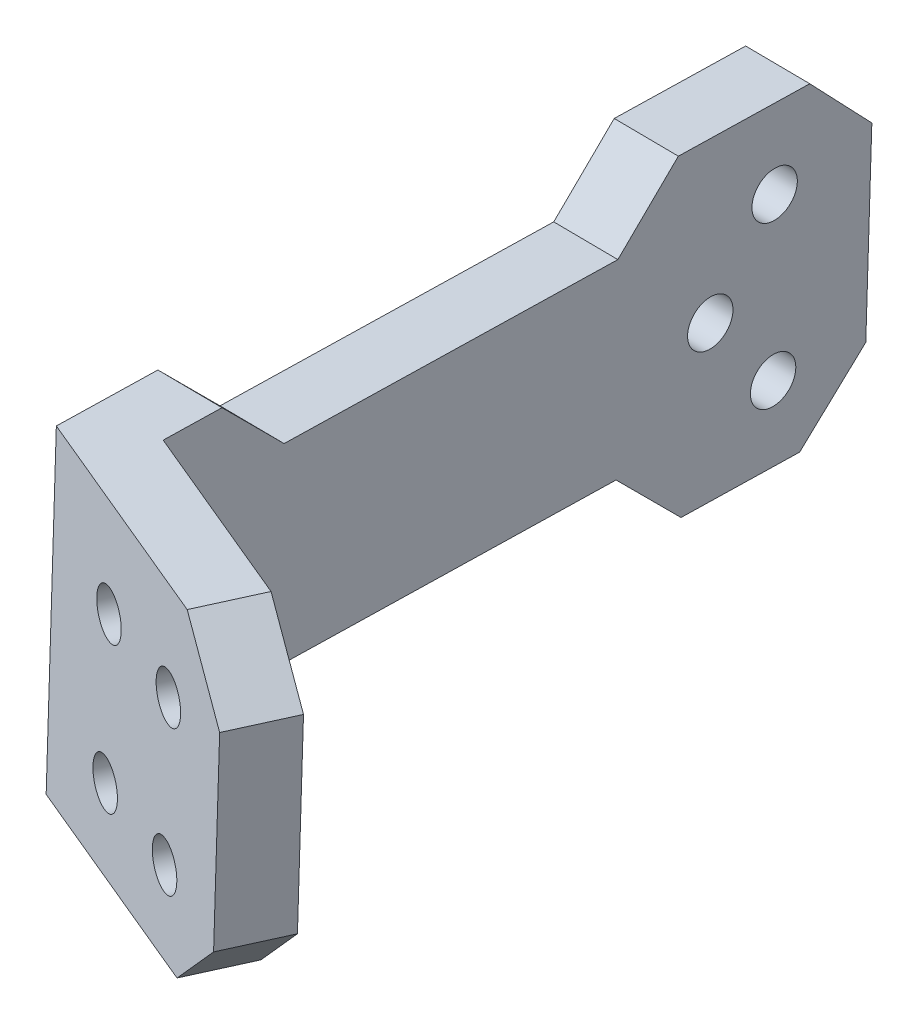
ISO-10303-21;
HEADER;
FILE_DESCRIPTION(('STEP AP214'),'2;1');
FILE_NAME('part.step','',(''),(''),'','','');
FILE_SCHEMA(('AUTOMOTIVE_DESIGN { 1 0 10303 214 1 1 1 1 }'));
ENDSEC;
DATA;
#1=APPLICATION_CONTEXT('core data for automotive mechanical design processes');
#2=APPLICATION_PROTOCOL_DEFINITION('international standard','automotive_design',2000,#1);
#3=PRODUCT_CONTEXT('',#1,'mechanical');
#4=PRODUCT('Part','Part','',(#3));
#5=PRODUCT_RELATED_PRODUCT_CATEGORY('part','',(#4));
#6=PRODUCT_DEFINITION_FORMATION('','',#4);
#7=PRODUCT_DEFINITION_CONTEXT('part definition',#1,'design');
#8=PRODUCT_DEFINITION('design','',#6,#7);
#9=PRODUCT_DEFINITION_SHAPE('','',#8);
#10=(LENGTH_UNIT() NAMED_UNIT(*) SI_UNIT(.MILLI.,.METRE.));
#11=(NAMED_UNIT(*) PLANE_ANGLE_UNIT() SI_UNIT($,.RADIAN.));
#12=(NAMED_UNIT(*) SI_UNIT($,.STERADIAN.) SOLID_ANGLE_UNIT());
#13=UNCERTAINTY_MEASURE_WITH_UNIT(LENGTH_MEASURE(1.E-05),#10,'distance_accuracy_value','');
#14=(GEOMETRIC_REPRESENTATION_CONTEXT(3) GLOBAL_UNCERTAINTY_ASSIGNED_CONTEXT((#13)) GLOBAL_UNIT_ASSIGNED_CONTEXT((#10,
#11,#12)) REPRESENTATION_CONTEXT('',''));
#15=CARTESIAN_POINT('',(0.,0.,0.));
#16=DIRECTION('',(0.,0.,1.));
#17=DIRECTION('',(1.,0.,0.));
#18=AXIS2_PLACEMENT_3D('',#15,#16,#17);
#19=CARTESIAN_POINT('',(0.677625199987656,71.7125158688856,-1.62510661202803));
#20=DIRECTION('',(-0.00944634334495136,-0.999698722892989,0.0226545810717298));
#21=DIRECTION('',(0.,-0.0226555919120575,-0.999743329137591));
#22=AXIS2_PLACEMENT_3D('',#19,#20,#21);
#23=PLANE('',#22);
#24=DIRECTION('',(0.,0.0226555919120575,0.999743329137591));
#25=VECTOR('',#24,1.);
#26=CARTESIAN_POINT('',(-79.7096790930301,74.4273959437813,84.6574894141304));
#27=LINE('',#26,#25);
#28=CARTESIAN_POINT('',(-79.7096790930301,72.8806724105701,16.403852945465));
#29=VERTEX_POINT('',#28);
#30=CARTESIAN_POINT('',(-79.7096790930301,73.1756143071616,29.4190147097265));
#31=VERTEX_POINT('',#30);
#32=EDGE_CURVE('E290',#29,#31,#27,.T.);
#33=ORIENTED_EDGE('',*,*,#32,.T.);
#34=DIRECTION('',(0.999955382303335,-0.00944391874385843,0.000214012499883211));
#35=VECTOR('',#34,1.);
#36=CARTESIAN_POINT('',(0.677625199987693,72.4164092634002,29.4362193653092));
#37=LINE('',#36,#35);
#38=CARTESIAN_POINT('',(-73.359962415404,73.1156454231381,29.4203736891007));
#39=VERTEX_POINT('',#38);
#40=EDGE_CURVE('E11',#31,#39,#37,.T.);
#41=ORIENTED_EDGE('',*,*,#40,.T.);
#42=DIRECTION('',(0.,-0.0226555919120574,-0.999743329137591));
#43=VECTOR('',#42,1.);
#44=CARTESIAN_POINT('',(-73.359962415404,72.676840517905,10.0568417848155));
#45=LINE('',#44,#43);
#46=CARTESIAN_POINT('',(-73.359962415404,72.8207035265466,16.4052119248392));
#47=VERTEX_POINT('',#46);
#48=EDGE_CURVE('E190',#39,#47,#45,.T.);
#49=ORIENTED_EDGE('',*,*,#48,.T.);
#50=DIRECTION('',(-0.999955382303335,0.0094439187438584,-0.000214012499884351));
#51=VECTOR('',#50,1.);
#52=CARTESIAN_POINT('',(-79.7096790930301,72.8806724105701,16.403852945465));
#53=LINE('',#52,#51);
#54=EDGE_CURVE('E251',#47,#29,#53,.T.);
#55=ORIENTED_EDGE('',*,*,#54,.T.);
#56=EDGE_LOOP('',(#33,#41,#49,#55));
#57=FACE_BOUND('',#56,.T.);
#58=ADVANCED_FACE('F39',(#57),#23,.F.);
#59=CARTESIAN_POINT('',(-14.6991602759016,44.2871439133381,167.493261540189));
#60=DIRECTION('',(0.00944634334495239,0.999698722892989,-0.0226545810717298));
#61=DIRECTION('',(-0.999955376576697,0.00944634334495237,-0.000107017596546688));
#62=AXIS2_PLACEMENT_3D('',#59,#60,#61);
#63=PLANE('',#62);
#64=DIRECTION('',(0.,-0.0226555919120575,-0.999743329137591));
#65=VECTOR('',#64,1.);
#66=CARTESIAN_POINT('',(-80.0062344739473,43.0431846417096,85.3686998448665));
#67=LINE('',#66,#65);
#68=CARTESIAN_POINT('',(-80.0062344739473,43.0431846417095,85.3686998448665));
#69=VERTEX_POINT('',#68);
#70=CARTESIAN_POINT('',(-80.0062344739473,42.7991965757842,74.6020228035035));
#71=VERTEX_POINT('',#70);
#72=EDGE_CURVE('E215',#69,#71,#67,.T.);
#73=ORIENTED_EDGE('',*,*,#72,.T.);
#74=DIRECTION('',(0.999955382303335,-0.00944391874385943,0.000214012499884219));
#75=VECTOR('',#74,1.);
#76=CARTESIAN_POINT('',(-14.6991602759016,42.1824143542566,74.6159999573412));
#77=LINE('',#76,#75);
#78=CARTESIAN_POINT('',(-73.6565177963211,42.7392276917607,74.6033817828778));
#79=VERTEX_POINT('',#78);
#80=EDGE_CURVE('E172',#71,#79,#77,.T.);
#81=ORIENTED_EDGE('',*,*,#80,.T.);
#82=DIRECTION('',(0.,0.0226555919120575,0.999743329137591));
#83=VECTOR('',#82,1.);
#84=CARTESIAN_POINT('',(-73.6565177963211,41.2926292158333,10.7680522155516));
#85=LINE('',#84,#83);
#86=CARTESIAN_POINT('',(-73.6565177963211,42.8873230611118,81.1385170448318));
#87=VERTEX_POINT('',#86);
#88=EDGE_CURVE('E274',#79,#87,#85,.T.);
#89=ORIENTED_EDGE('',*,*,#88,.T.);
#90=DIRECTION('',(0.922976587647695,0.,0.38485610123034));
#91=VECTOR('',#90,1.);
#92=CARTESIAN_POINT('',(-49.4786824739531,42.8873230611118,91.2200159288615));
#93=LINE('',#92,#91);
#94=CARTESIAN_POINT('',(-55.339583805516,42.8873230611118,88.7761796860488));
#95=VERTEX_POINT('',#94);
#96=EDGE_CURVE('E201',#87,#95,#93,.T.);
#97=ORIENTED_EDGE('',*,*,#96,.T.);
#98=DIRECTION('',(-0.384740152897546,0.0245451308027948,0.922698515931529));
#99=VECTOR('',#98,1.);
#100=CARTESIAN_POINT('',(-57.7826837764154,43.0431846417096,94.635315262214));
#101=LINE('',#100,#99);
#102=CARTESIAN_POINT('',(-57.7826837764154,43.0431846417096,94.635315262214));
#103=VERTEX_POINT('',#102);
#104=EDGE_CURVE('E214',#95,#103,#101,.T.);
#105=ORIENTED_EDGE('',*,*,#104,.T.);
#106=DIRECTION('',(-0.922976587647694,0.,-0.384856101230341));
#107=VECTOR('',#106,1.);
#108=CARTESIAN_POINT('',(-80.0062344739473,43.0431846417096,85.3686998448665));
#109=LINE('',#108,#107);
#110=EDGE_CURVE('E212',#103,#69,#109,.T.);
#111=ORIENTED_EDGE('',*,*,#110,.T.);
#112=EDGE_LOOP('',(#73,#81,#89,#97,#105,#111));
#113=FACE_BOUND('',#112,.T.);
#114=ADVANCED_FACE('F272',(#113),#63,.F.);
#115=CARTESIAN_POINT('',(-80.8710501892957,-48.4795490342398,87.4427338938127));
#116=DIRECTION('',(-0.999955382303335,0.00944391874385943,-0.000214012499884421));
#117=DIRECTION('',(-0.00944391896013155,-0.999955405202989,0.));
#118=AXIS2_PLACEMENT_3D('',#115,#116,#117);
#119=PLANE('',#118);
#120=DIRECTION('',(-0.00682918207909545,-0.707073818757855,0.707106764993317));
#121=VECTOR('',#120,1.);
#122=CARTESIAN_POINT('',(-80.5773681736715,-16.662410896713,119.261225933014));
#123=LINE('',#122,#121);
#124=CARTESIAN_POINT('',(-79.766958551444,67.2450643631087,35.3498409888518));
#125=VERTEX_POINT('',#124);
#126=EDGE_CURVE('E323',#31,#125,#123,.T.);
#127=ORIENTED_EDGE('',*,*,#126,.F.);
#128=ORIENTED_EDGE('',*,*,#32,.F.);
#129=DIRECTION('',(-0.00667957343663226,-0.722913668773976,-0.690906079578444));
#130=VECTOR('',#129,1.);
#131=CARTESIAN_POINT('',(-79.9679082336864,44.9331728842632,-10.3062483650945));
#132=LINE('',#131,#130);
#133=CARTESIAN_POINT('',(-79.7696633732706,66.388722511558,10.1993393952467));
#134=VERTEX_POINT('',#133);
#135=EDGE_CURVE('E244',#29,#134,#132,.T.);
#136=ORIENTED_EDGE('',*,*,#135,.T.);
#137=DIRECTION('',(0.00944634334495239,0.999698722892989,-0.0226545810717298));
#138=VECTOR('',#137,1.);
#139=CARTESIAN_POINT('',(-80.8710501892957,-50.1701355760925,12.8407272851236));
#140=LINE('',#139,#138);
#141=CARTESIAN_POINT('',(-79.9462501937068,47.7006849902273,10.6228366463719));
#142=VERTEX_POINT('',#141);
#143=EDGE_CURVE('E198',#142,#134,#140,.T.);
#144=ORIENTED_EDGE('',*,*,#143,.F.);
#145=DIRECTION('',(-0.00667957343663225,-0.690873823428353,0.722944495379966));
#146=VECTOR('',#145,1.);
#147=CARTESIAN_POINT('',(-80.761098739098,-36.5797762413307,98.815634591854));
#148=LINE('',#147,#146);
#149=CARTESIAN_POINT('',(-80.0062344739473,41.4964611084984,17.115063376201));
#150=VERTEX_POINT('',#149);
#151=EDGE_CURVE('E246',#142,#150,#148,.T.);
#152=ORIENTED_EDGE('',*,*,#151,.T.);
#153=CARTESIAN_POINT('',(-80.0062344739472,41.7625322039023,28.8562177781239));
#154=VERTEX_POINT('',#153);
#155=EDGE_CURVE('E285',#154,#150,#67,.T.);
#156=ORIENTED_EDGE('',*,*,#155,.F.);
#157=DIRECTION('',(-0.00652653619627508,-0.707076677048504,-0.707106764993325));
#158=VECTOR('',#157,1.);
#159=CARTESIAN_POINT('',(-80.1523426907388,25.9333527875086,13.0263647891287));
#160=LINE('',#159,#158);
#161=CARTESIAN_POINT('',(-79.9462988757775,48.2558791058935,35.3498409888517));
#162=VERTEX_POINT('',#161);
#163=EDGE_CURVE('E63',#162,#154,#160,.T.);
#164=ORIENTED_EDGE('',*,*,#163,.F.);
#165=DIRECTION('',(0.,-0.0226555919120575,-0.999743329137591));
#166=VECTOR('',#165,1.);
#167=CARTESIAN_POINT('',(-79.9462988757775,49.3861195487064,85.2249600062605));
#168=LINE('',#167,#166);
#169=CARTESIAN_POINT('',(-79.9462988757775,49.0047555704962,68.3961746596215));
#170=VERTEX_POINT('',#169);
#171=EDGE_CURVE('E320',#170,#162,#168,.T.);
#172=ORIENTED_EDGE('',*,*,#171,.F.);
#173=DIRECTION('',(0.00682918207909539,0.707073818757849,-0.707106764993324));
#174=VECTOR('',#173,1.);
#175=CARTESIAN_POINT('',(-80.509043049518,-9.26015336031544,126.66379845465));
#176=LINE('',#175,#174);
#177=EDGE_CURVE('E319',#71,#170,#176,.T.);
#178=ORIENTED_EDGE('',*,*,#177,.F.);
#179=ORIENTED_EDGE('',*,*,#72,.F.);
#180=DIRECTION('',(0.00944634334495239,0.999698722892989,-0.0226545810717298));
#181=VECTOR('',#180,1.);
#182=CARTESIAN_POINT('',(-80.8710501892957,-48.4795490342398,87.4427338938127));
#183=LINE('',#182,#181);
#184=CARTESIAN_POINT('',(-79.7096790930301,74.4273959437813,84.6574894141304));
#185=VERTEX_POINT('',#184);
#186=EDGE_CURVE('E189',#69,#185,#183,.T.);
#187=ORIENTED_EDGE('',*,*,#186,.T.);
#188=CARTESIAN_POINT('',(-79.7096790930301,74.1995249079103,74.6020228035036));
#189=VERTEX_POINT('',#188);
#190=EDGE_CURVE('E229',#189,#185,#27,.T.);
#191=ORIENTED_EDGE('',*,*,#190,.F.);
#192=DIRECTION('',(0.00652653619627499,0.707076677048495,0.707106764993334));
#193=VECTOR('',#192,1.);
#194=CARTESIAN_POINT('',(-80.2166038918847,19.2799333346451,19.6800942593051));
#195=LINE('',#194,#193);
#196=CARTESIAN_POINT('',(-79.766958551444,67.9939408277113,68.3961746596216));
#197=VERTEX_POINT('',#196);
#198=EDGE_CURVE('E55',#197,#189,#195,.T.);
#199=ORIENTED_EDGE('',*,*,#198,.F.);
#200=DIRECTION('',(0.,0.0226555919120577,0.999743329137591));
#201=VECTOR('',#200,1.);
#202=CARTESIAN_POINT('',(-79.766958551444,68.365558115815,84.7948591970185));
#203=LINE('',#202,#201);
#204=EDGE_CURVE('E331',#125,#197,#203,.T.);
#205=ORIENTED_EDGE('',*,*,#204,.F.);
#206=EDGE_LOOP('',(#127,#128,#136,#144,#152,#156,#164,#172,#178,#179,#187,#191,#199,#205));
#207=FACE_BOUND('',#206,.T.);
#208=CARTESIAN_POINT('',(-79.9357155551836,49.0243422093975,19.810817403018));
#209=DIRECTION('',(-0.999955382303335,0.00944391874385943,-0.000214012499884421));
#210=DIRECTION('',(-0.00944391896013155,-0.999955405202989,0.));
#211=AXIS2_PLACEMENT_3D('',#208,#209,#210);
#212=CIRCLE('',#211,2.2479);
#213=CARTESIAN_POINT('',(-79.956944540614,46.7765424540417,19.810817403018));
#214=VERTEX_POINT('',#213);
#215=EDGE_CURVE('E348',#214,#214,#212,.T.);
#216=ORIENTED_EDGE('',*,*,#215,.F.);
#217=EDGE_LOOP('',(#216));
#218=FACE_BOUND('',#217,.T.);
#219=CARTESIAN_POINT('',(-79.7842211516335,65.0651032882848,19.8108174030179));
#220=DIRECTION('',(-0.999955382303335,0.00944391874385943,-0.000214012499884421));
#221=DIRECTION('',(-0.00944391896013155,-0.999955405202989,0.));
#222=AXIS2_PLACEMENT_3D('',#219,#220,#221);
#223=CIRCLE('',#222,2.2479);
#224=CARTESIAN_POINT('',(-79.805450137064,62.817303532929,19.8108174030179));
#225=VERTEX_POINT('',#224);
#226=EDGE_CURVE('E345',#225,#225,#223,.T.);
#227=ORIENTED_EDGE('',*,*,#226,.F.);
#228=EDGE_LOOP('',(#227));
#229=FACE_BOUND('',#228,.T.);
#230=CARTESIAN_POINT('',(-79.8603841444811,57.143350836971,26.105814993145));
#231=DIRECTION('',(-0.999955382303335,0.00944391874385943,-0.000214012499884421));
#232=DIRECTION('',(-0.00944391896013155,-0.999955405202989,0.));
#233=AXIS2_PLACEMENT_3D('',#230,#231,#232);
#234=CIRCLE('',#233,2.2479);
#235=CARTESIAN_POINT('',(-79.8816131299115,54.8955510816152,26.105814993145));
#236=VERTEX_POINT('',#235);
#237=EDGE_CURVE('E337',#236,#236,#234,.T.);
#238=ORIENTED_EDGE('',*,*,#237,.F.);
#239=EDGE_LOOP('',(#238));
#240=FACE_BOUND('',#239,.T.);
#241=ADVANCED_FACE('F316',(#207,#218,#229,#240),#119,.T.);
#242=CARTESIAN_POINT('',(-80.8710501892957,-50.1701355760925,12.8407272851236));
#243=DIRECTION('',(0.,-0.0226555919120575,-0.999743329137591));
#244=DIRECTION('',(0.,0.999743329137591,-0.0226555919120575));
#245=AXIS2_PLACEMENT_3D('',#242,#243,#244);
#246=PLANE('',#245);
#247=DIRECTION('',(0.00944634334495239,0.999698722892989,-0.0226545810717298));
#248=VECTOR('',#247,1.);
#249=CARTESIAN_POINT('',(-74.5213335116696,-50.230104460116,12.8420862644978));
#250=LINE('',#249,#248);
#251=CARTESIAN_POINT('',(-73.5965335160806,47.6407161062038,10.6241956257461));
#252=VERTEX_POINT('',#251);
#253=CARTESIAN_POINT('',(-73.4199466956444,66.3287536275345,10.200698374621));
#254=VERTEX_POINT('',#253);
#255=EDGE_CURVE('E202',#252,#254,#250,.T.);
#256=ORIENTED_EDGE('',*,*,#255,.F.);
#257=DIRECTION('',(-0.999955382303335,0.00944391874385943,-0.000214012499884375));
#258=VECTOR('',#257,1.);
#259=CARTESIAN_POINT('',(-79.9462501937068,47.7006849902273,10.6228366463719));
#260=LINE('',#259,#258);
#261=EDGE_CURVE('E242',#252,#142,#260,.T.);
#262=ORIENTED_EDGE('',*,*,#261,.T.);
#263=ORIENTED_EDGE('',*,*,#143,.T.);
#264=DIRECTION('',(0.999955382303335,-0.0094439187438584,0.000214012499884351));
#265=VECTOR('',#264,1.);
#266=CARTESIAN_POINT('',(-73.4199466956444,66.3287536275345,10.200698374621));
#267=LINE('',#266,#265);
#268=EDGE_CURVE('E240',#134,#254,#267,.T.);
#269=ORIENTED_EDGE('',*,*,#268,.T.);
#270=EDGE_LOOP('',(#256,#262,#263,#269));
#271=FACE_BOUND('',#270,.T.);
#272=ADVANCED_FACE('F373',(#271),#246,.T.);
#273=CARTESIAN_POINT('',(-74.5213335116696,-50.230104460116,12.8420862644978));
#274=DIRECTION('',(0.999955382303335,-0.00944391874385944,0.000214012499884224));
#275=DIRECTION('',(0.00944391896013156,0.999955405202989,0.));
#276=AXIS2_PLACEMENT_3D('',#273,#274,#275);
#277=PLANE('',#276);
#278=DIRECTION('',(0.00682918207909528,0.707073818757855,-0.707106764993317));
#279=VECTOR('',#278,1.);
#280=CARTESIAN_POINT('',(-73.4172418738179,67.1850954790851,35.3511999682261));
#281=LINE('',#280,#279);
#282=CARTESIAN_POINT('',(-73.4172418738179,67.1850954790851,35.3511999682261));
#283=VERTEX_POINT('',#282);
#284=EDGE_CURVE('E563',#283,#39,#281,.T.);
#285=ORIENTED_EDGE('',*,*,#284,.F.);
#286=DIRECTION('',(0.,-0.0226555919120577,-0.999743329137591));
#287=VECTOR('',#286,1.);
#288=CARTESIAN_POINT('',(-73.4172418738179,67.9339719436878,68.3975336389958));
#289=LINE('',#288,#287);
#290=CARTESIAN_POINT('',(-73.4172418738179,67.9339719436878,68.3975336389958));
#291=VERTEX_POINT('',#290);
#292=EDGE_CURVE('E181',#291,#283,#289,.T.);
#293=ORIENTED_EDGE('',*,*,#292,.F.);
#294=DIRECTION('',(-0.00652653619627642,-0.707076677048495,-0.707106764993333));
#295=VECTOR('',#294,1.);
#296=CARTESIAN_POINT('',(-73.3599624154039,74.1395560238868,74.6033817828779));
#297=LINE('',#296,#295);
#298=CARTESIAN_POINT('',(-73.3599624154039,74.1395560238868,74.6033817828779));
#299=VERTEX_POINT('',#298);
#300=EDGE_CURVE('E167',#299,#291,#297,.T.);
#301=ORIENTED_EDGE('',*,*,#300,.F.);
#302=CARTESIAN_POINT('',(-73.3599624154039,74.2715343631835,80.4273066140957));
#303=VERTEX_POINT('',#302);
#304=EDGE_CURVE('E179',#303,#299,#45,.T.);
#305=ORIENTED_EDGE('',*,*,#304,.F.);
#306=DIRECTION('',(0.00944634334495239,0.999698722892989,-0.0226545810717298));
#307=VECTOR('',#306,1.);
#308=CARTESIAN_POINT('',(-74.5213335116696,-48.6354106148375,83.2125510937781));
#309=LINE('',#308,#307);
#310=EDGE_CURVE('E205',#87,#303,#309,.T.);
#311=ORIENTED_EDGE('',*,*,#310,.F.);
#312=ORIENTED_EDGE('',*,*,#88,.F.);
#313=DIRECTION('',(-0.00682918207909415,-0.707073818757849,0.707106764993324));
#314=VECTOR('',#313,1.);
#315=CARTESIAN_POINT('',(-73.6565177963211,42.7392276917607,74.6033817828778));
#316=LINE('',#315,#314);
#317=CARTESIAN_POINT('',(-73.5965821981513,48.9447866864727,68.3975336389957));
#318=VERTEX_POINT('',#317);
#319=EDGE_CURVE('E281',#318,#79,#316,.T.);
#320=ORIENTED_EDGE('',*,*,#319,.F.);
#321=DIRECTION('',(0.,0.0226555919120575,0.999743329137591));
#322=VECTOR('',#321,1.);
#323=CARTESIAN_POINT('',(-73.5965821981513,48.9447866864727,68.3975336389957));
#324=LINE('',#323,#322);
#325=CARTESIAN_POINT('',(-73.5965821981513,48.19591022187,35.3511999682259));
#326=VERTEX_POINT('',#325);
#327=EDGE_CURVE('E571',#326,#318,#324,.T.);
#328=ORIENTED_EDGE('',*,*,#327,.F.);
#329=DIRECTION('',(0.00652653619627541,0.707076677048504,0.707106764993324));
#330=VECTOR('',#329,1.);
#331=CARTESIAN_POINT('',(-73.5965821981513,48.19591022187,35.3511999682259));
#332=LINE('',#331,#330);
#333=CARTESIAN_POINT('',(-73.6565177963211,41.7025633198788,28.8575767574982));
#334=VERTEX_POINT('',#333);
#335=EDGE_CURVE('E568',#334,#326,#332,.T.);
#336=ORIENTED_EDGE('',*,*,#335,.F.);
#337=CARTESIAN_POINT('',(-73.6565177963211,41.4364922244749,17.1164223555753));
#338=VERTEX_POINT('',#337);
#339=EDGE_CURVE('E282',#338,#334,#85,.T.);
#340=ORIENTED_EDGE('',*,*,#339,.F.);
#341=DIRECTION('',(0.00667957343663211,0.690873823428353,-0.722944495379966));
#342=VECTOR('',#341,1.);
#343=CARTESIAN_POINT('',(-74.0589335138751,-0.185699376786717,60.670734710996));
#344=LINE('',#343,#342);
#345=EDGE_CURVE('E238',#338,#252,#344,.T.);
#346=ORIENTED_EDGE('',*,*,#345,.T.);
#347=ORIENTED_EDGE('',*,*,#255,.T.);
#348=DIRECTION('',(0.0066795734366324,0.722913668773976,0.690906079578444));
#349=VECTOR('',#348,1.);
#350=CARTESIAN_POINT('',(-73.970640103657,6.7285717098195,-46.7606371341771));
#351=LINE('',#350,#349);
#352=EDGE_CURVE('E235',#254,#47,#351,.T.);
#353=ORIENTED_EDGE('',*,*,#352,.T.);
#354=ORIENTED_EDGE('',*,*,#48,.F.);
#355=EDGE_LOOP('',(#285,#293,#301,#305,#311,#312,#320,#328,#336,#340,#346,#347,#353,#354));
#356=FACE_BOUND('',#355,.T.);
#357=CARTESIAN_POINT('',(-73.5859988775574,48.964373325374,19.8121763823922));
#358=DIRECTION('',(0.999955382303335,-0.00944391874385944,0.000214012499884215));
#359=DIRECTION('',(0.00944391896013156,0.999955405202989,0.));
#360=AXIS2_PLACEMENT_3D('',#357,#358,#359);
#361=CIRCLE('',#360,2.2479);
#362=CARTESIAN_POINT('',(-73.5647698921269,51.2121730807298,19.8121763823922));
#363=VERTEX_POINT('',#362);
#364=EDGE_CURVE('E334',#363,#363,#361,.T.);
#365=ORIENTED_EDGE('',*,*,#364,.F.);
#366=EDGE_LOOP('',(#365));
#367=FACE_BOUND('',#366,.T.);
#368=CARTESIAN_POINT('',(-73.4345044740074,65.0051344042613,19.8121763823921));
#369=DIRECTION('',(0.999955382303335,-0.00944391874385944,0.000214012499884215));
#370=DIRECTION('',(0.00944391896013156,0.999955405202989,0.));
#371=AXIS2_PLACEMENT_3D('',#368,#369,#370);
#372=CIRCLE('',#371,2.2479);
#373=CARTESIAN_POINT('',(-73.4132754885769,67.2529341596171,19.8121763823921));
#374=VERTEX_POINT('',#373);
#375=EDGE_CURVE('E338',#374,#374,#372,.T.);
#376=ORIENTED_EDGE('',*,*,#375,.F.);
#377=EDGE_LOOP('',(#376));
#378=FACE_BOUND('',#377,.T.);
#379=CARTESIAN_POINT('',(-73.5106674668549,57.0833819529475,26.1071739725193));
#380=DIRECTION('',(0.999955382303335,-0.00944391874385944,0.000214012499884215));
#381=DIRECTION('',(0.00944391896013156,0.999955405202989,0.));
#382=AXIS2_PLACEMENT_3D('',#379,#380,#381);
#383=CIRCLE('',#382,2.2479);
#384=CARTESIAN_POINT('',(-73.4894384814244,59.3311817083033,26.1071739725193));
#385=VERTEX_POINT('',#384);
#386=EDGE_CURVE('E333',#385,#385,#383,.T.);
#387=ORIENTED_EDGE('',*,*,#386,.F.);
#388=EDGE_LOOP('',(#387));
#389=FACE_BOUND('',#388,.T.);
#390=ADVANCED_FACE('F176',(#356,#367,#378,#389),#277,.T.);
#391=CARTESIAN_POINT('',(-50.3434981893016,-48.6354106148375,93.2940499778077));
#392=DIRECTION('',(0.384740152897546,-0.0245451308027948,-0.922698515931529));
#393=DIRECTION('',(-0.922976587647695,0.,-0.38485610123034));
#394=AXIS2_PLACEMENT_3D('',#391,#392,#393);
#395=PLANE('',#394);
#396=CARTESIAN_POINT('',(-57.8117036717517,50.7250680491896,87.5368775396771));
#397=DIRECTION('',(0.384740152897547,-0.0245451308027948,-0.922698515931529));
#398=DIRECTION('',(-0.922976587647694,0.,-0.384856101230341));
#399=AXIS2_PLACEMENT_3D('',#396,#397,#398);
#400=CIRCLE('',#399,2.24789999999999);
#401=CARTESIAN_POINT('',(-59.886462743125,50.7250680491896,86.6717595097214));
#402=VERTEX_POINT('',#401);
#403=EDGE_CURVE('E355',#402,#402,#400,.T.);
#404=ORIENTED_EDGE('',*,*,#403,.F.);
#405=EDGE_LOOP('',(#404));
#406=FACE_BOUND('',#405,.T.);
#407=CARTESIAN_POINT('',(-67.8938108719946,64.9010363431659,82.9558119057789));
#408=DIRECTION('',(0.384740152897547,-0.0245451308027948,-0.922698515931529));
#409=DIRECTION('',(-0.922976587647694,0.,-0.384856101230341));
#410=AXIS2_PLACEMENT_3D('',#407,#408,#409);
#411=CIRCLE('',#410,2.2479);
#412=CARTESIAN_POINT('',(-69.9685699433679,64.9010363431659,82.0906938758232));
#413=VERTEX_POINT('',#412);
#414=EDGE_CURVE('E354',#413,#413,#411,.T.);
#415=ORIENTED_EDGE('',*,*,#414,.F.);
#416=EDGE_LOOP('',(#415));
#417=FACE_BOUND('',#416,.T.);
#418=CARTESIAN_POINT('',(-67.8938108719946,50.6133155314965,83.335886188051));
#419=DIRECTION('',(0.384740152897547,-0.0245451308027948,-0.922698515931529));
#420=DIRECTION('',(-0.922976587647694,0.,-0.384856101230341));
#421=AXIS2_PLACEMENT_3D('',#418,#419,#420);
#422=CIRCLE('',#421,2.24790000000001);
#423=CARTESIAN_POINT('',(-69.9685699433679,50.6133155314965,82.4707681580953));
#424=VERTEX_POINT('',#423);
#425=EDGE_CURVE('E351',#424,#424,#422,.T.);
#426=ORIENTED_EDGE('',*,*,#425,.F.);
#427=EDGE_LOOP('',(#426));
#428=FACE_BOUND('',#427,.T.);
#429=CARTESIAN_POINT('',(-57.8117036717517,64.9010363431659,87.1597760379145));
#430=DIRECTION('',(0.384740152897547,-0.0245451308027948,-0.922698515931529));
#431=DIRECTION('',(-0.922976587647694,0.,-0.384856101230341));
#432=AXIS2_PLACEMENT_3D('',#429,#430,#431);
#433=CIRCLE('',#432,2.24790000000001);
#434=CARTESIAN_POINT('',(-59.886462743125,64.9010363431659,86.2946580079588));
#435=VERTEX_POINT('',#434);
#436=EDGE_CURVE('E220',#435,#435,#433,.T.);
#437=ORIENTED_EDGE('',*,*,#436,.F.);
#438=EDGE_LOOP('',(#437));
#439=FACE_BOUND('',#438,.T.);
#440=DIRECTION('',(0.00944634334495239,0.999698722892989,-0.0226545810717298));
#441=VECTOR('',#440,1.);
#442=CARTESIAN_POINT('',(-50.3434981893016,-48.6354106148375,93.2940499778077));
#443=LINE('',#442,#441);
#444=CARTESIAN_POINT('',(-49.4186981937127,49.2354099514823,91.076159339056));
#445=VERTEX_POINT('',#444);
#446=CARTESIAN_POINT('',(-49.2421113732764,67.923447472813,90.6526620879308));
#447=VERTEX_POINT('',#446);
#448=EDGE_CURVE('E207',#445,#447,#443,.T.);
#449=ORIENTED_EDGE('',*,*,#448,.F.);
#450=DIRECTION('',(-0.659322577438735,-0.706893746101166,-0.256115151060229));
#451=VECTOR('',#450,1.);
#452=CARTESIAN_POINT('',(-95.0609478441965,0.299999668322178,73.3463377555557));
#453=LINE('',#452,#451);
#454=EDGE_CURVE('E264',#445,#95,#453,.T.);
#455=ORIENTED_EDGE('',*,*,#454,.T.);
#456=ORIENTED_EDGE('',*,*,#96,.F.);
#457=ORIENTED_EDGE('',*,*,#310,.T.);
#458=DIRECTION('',(-0.922976587647694,0.,-0.38485610123034));
#459=VECTOR('',#458,1.);
#460=CARTESIAN_POINT('',(-49.182127093036,74.2715343631835,90.5088054981254));
#461=LINE('',#460,#459);
#462=CARTESIAN_POINT('',(-55.0430284245989,74.2715343631835,88.0649692553127));
#463=VERTEX_POINT('',#462);
#464=EDGE_CURVE('E187',#463,#303,#461,.T.);
#465=ORIENTED_EDGE('',*,*,#464,.F.);
#466=DIRECTION('',(0.645963430565471,-0.706893746101166,0.28815356686175));
#467=VECTOR('',#466,1.);
#468=CARTESIAN_POINT('',(4.01395451241442,9.6440184289875,114.409309315704));
#469=LINE('',#468,#467);
#470=EDGE_CURVE('E262',#463,#447,#469,.T.);
#471=ORIENTED_EDGE('',*,*,#470,.T.);
#472=EDGE_LOOP('',(#449,#455,#456,#457,#465,#471));
#473=FACE_BOUND('',#472,.T.);
#474=ADVANCED_FACE('F303',(#406,#417,#428,#439,#473),#395,.T.);
#475=CARTESIAN_POINT('',(-52.786598160201,-48.4795490342398,99.1531855539729));
#476=DIRECTION('',(0.922976587647694,0.,0.38485610123034));
#477=DIRECTION('',(0.38485610123034,0.,-0.922976587647694));
#478=AXIS2_PLACEMENT_3D('',#475,#476,#477);
#479=PLANE('',#478);
#480=DIRECTION('',(0.00944634334495239,0.999698722892989,-0.0226545810717298));
#481=VECTOR('',#480,1.);
#482=CARTESIAN_POINT('',(-52.786598160201,-48.4795490342398,99.1531855539729));
#483=LINE('',#482,#481);
#484=CARTESIAN_POINT('',(-51.8617981646121,49.39127153208,96.9352949152212));
#485=VERTEX_POINT('',#484);
#486=CARTESIAN_POINT('',(-51.6852113441758,68.0793090534108,96.511797664096));
#487=VERTEX_POINT('',#486);
#488=EDGE_CURVE('E193',#485,#487,#483,.T.);
#489=ORIENTED_EDGE('',*,*,#488,.F.);
#490=DIRECTION('',(0.384740152897546,-0.0245451308027948,-0.922698515931529));
#491=VECTOR('',#490,1.);
#492=CARTESIAN_POINT('',(-49.4186981937127,49.2354099514823,91.076159339056));
#493=LINE('',#492,#491);
#494=EDGE_CURVE('E260',#485,#445,#493,.T.);
#495=ORIENTED_EDGE('',*,*,#494,.T.);
#496=ORIENTED_EDGE('',*,*,#448,.T.);
#497=DIRECTION('',(-0.384740152897546,0.0245451308027944,0.922698515931529));
#498=VECTOR('',#497,1.);
#499=CARTESIAN_POINT('',(-51.6852113441758,68.0793090534108,96.511797664096));
#500=LINE('',#499,#498);
#501=EDGE_CURVE('E258',#447,#487,#500,.T.);
#502=ORIENTED_EDGE('',*,*,#501,.T.);
#503=EDGE_LOOP('',(#489,#495,#496,#502));
#504=FACE_BOUND('',#503,.T.);
#505=ADVANCED_FACE('F307',(#504),#479,.T.);
#506=CARTESIAN_POINT('',(-80.8710501892957,-48.4795490342398,87.4427338938127));
#507=DIRECTION('',(-0.384740152897546,0.0245451308027948,0.922698515931529));
#508=DIRECTION('',(0.922976587647694,0.,0.38485610123034));
#509=AXIS2_PLACEMENT_3D('',#506,#507,#508);
#510=PLANE('',#509);
#511=CARTESIAN_POINT('',(-60.2548036426511,50.8809296297874,93.3960131158423));
#512=DIRECTION('',(-0.384740152897546,0.0245451308027948,0.922698515931529));
#513=DIRECTION('',(0.922976587647694,0.,0.38485610123034));
#514=AXIS2_PLACEMENT_3D('',#511,#512,#513);
#515=CIRCLE('',#514,2.24789999999999);
#516=CARTESIAN_POINT('',(-58.1800445712779,50.8809296297874,94.261131145798));
#517=VERTEX_POINT('',#516);
#518=EDGE_CURVE('E226',#517,#517,#515,.T.);
#519=ORIENTED_EDGE('',*,*,#518,.F.);
#520=EDGE_LOOP('',(#519));
#521=FACE_BOUND('',#520,.T.);
#522=CARTESIAN_POINT('',(-70.336910842894,65.0568979237636,88.8149474819441));
#523=DIRECTION('',(-0.384740152897546,0.0245451308027948,0.922698515931529));
#524=DIRECTION('',(0.922976587647694,0.,0.38485610123034));
#525=AXIS2_PLACEMENT_3D('',#522,#523,#524);
#526=CIRCLE('',#525,2.2479);
#527=CARTESIAN_POINT('',(-68.2621517715208,65.0568979237636,89.6800655118998));
#528=VERTEX_POINT('',#527);
#529=EDGE_CURVE('E223',#528,#528,#526,.T.);
#530=ORIENTED_EDGE('',*,*,#529,.F.);
#531=EDGE_LOOP('',(#530));
#532=FACE_BOUND('',#531,.T.);
#533=CARTESIAN_POINT('',(-70.336910842894,50.7691771120942,89.1950217642162));
#534=DIRECTION('',(-0.384740152897546,0.0245451308027948,0.922698515931529));
#535=DIRECTION('',(0.922976587647694,0.,0.38485610123034));
#536=AXIS2_PLACEMENT_3D('',#533,#534,#535);
#537=CIRCLE('',#536,2.24790000000001);
#538=CARTESIAN_POINT('',(-68.2621517715208,50.7691771120942,90.0601397941719));
#539=VERTEX_POINT('',#538);
#540=EDGE_CURVE('E219',#539,#539,#537,.T.);
#541=ORIENTED_EDGE('',*,*,#540,.F.);
#542=EDGE_LOOP('',(#541));
#543=FACE_BOUND('',#542,.T.);
#544=CARTESIAN_POINT('',(-60.2548036426511,65.0568979237636,93.0189116140797));
#545=DIRECTION('',(-0.384740152897546,0.0245451308027948,0.922698515931529));
#546=DIRECTION('',(0.922976587647694,0.,0.38485610123034));
#547=AXIS2_PLACEMENT_3D('',#544,#545,#546);
#548=CIRCLE('',#547,2.24790000000001);
#549=CARTESIAN_POINT('',(-58.1800445712779,65.0568979237636,93.8840296440354));
#550=VERTEX_POINT('',#549);
#551=EDGE_CURVE('E216',#550,#550,#548,.T.);
#552=ORIENTED_EDGE('',*,*,#551,.F.);
#553=EDGE_LOOP('',(#552));
#554=FACE_BOUND('',#553,.T.);
#555=ORIENTED_EDGE('',*,*,#110,.F.);
#556=DIRECTION('',(0.659322577438735,0.706893746101166,0.256115151060229));
#557=VECTOR('',#556,1.);
#558=CARTESIAN_POINT('',(-111.689991113522,-14.7536203361927,73.6949157759303));
#559=LINE('',#558,#557);
#560=EDGE_CURVE('E256',#103,#485,#559,.T.);
#561=ORIENTED_EDGE('',*,*,#560,.T.);
#562=ORIENTED_EDGE('',*,*,#488,.T.);
#563=DIRECTION('',(-0.645963430565471,0.706893746101166,-0.28815356686175));
#564=VECTOR('',#563,1.);
#565=CARTESIAN_POINT('',(-12.3276541891531,25.0093615946979,114.0685507875));
#566=LINE('',#565,#564);
#567=CARTESIAN_POINT('',(-57.4861283954983,74.4273959437813,93.9241048314779));
#568=VERTEX_POINT('',#567);
#569=EDGE_CURVE('E254',#487,#568,#566,.T.);
#570=ORIENTED_EDGE('',*,*,#569,.T.);
#571=DIRECTION('',(0.922976587647694,0.,0.384856101230341));
#572=VECTOR('',#571,1.);
#573=CARTESIAN_POINT('',(-79.7096790930301,74.4273959437813,84.6574894141304));
#574=LINE('',#573,#572);
#575=EDGE_CURVE('E292',#185,#568,#574,.T.);
#576=ORIENTED_EDGE('',*,*,#575,.F.);
#577=ORIENTED_EDGE('',*,*,#186,.F.);
#578=EDGE_LOOP('',(#555,#561,#562,#570,#576,#577));
#579=FACE_BOUND('',#578,.T.);
#580=ADVANCED_FACE('F313',(#521,#532,#543,#554,#579),#510,.T.);
#581=ORIENTED_EDGE('',*,*,#304,.T.);
#582=DIRECTION('',(-0.999955382303335,0.00944391874385838,-0.000214012499885282));
#583=VECTOR('',#582,1.);
#584=CARTESIAN_POINT('',(0.677625199987589,73.4403198641489,74.6192274590865));
#585=LINE('',#584,#583);
#586=EDGE_CURVE('E48',#299,#189,#585,.T.);
#587=ORIENTED_EDGE('',*,*,#586,.T.);
#588=ORIENTED_EDGE('',*,*,#190,.T.);
#589=ORIENTED_EDGE('',*,*,#575,.T.);
#590=DIRECTION('',(0.384740152897546,-0.0245451308027944,-0.922698515931529));
#591=VECTOR('',#590,1.);
#592=CARTESIAN_POINT('',(-55.0430284245989,74.2715343631836,88.0649692553127));
#593=LINE('',#592,#591);
#594=EDGE_CURVE('E249',#568,#463,#593,.T.);
#595=ORIENTED_EDGE('',*,*,#594,.T.);
#596=ORIENTED_EDGE('',*,*,#464,.T.);
#597=EDGE_LOOP('',(#581,#587,#588,#589,#595,#596));
#598=FACE_BOUND('',#597,.T.);
#599=ADVANCED_FACE('F184',(#598),#23,.F.);
#600=ORIENTED_EDGE('',*,*,#339,.T.);
#601=DIRECTION('',(-0.999955382303335,0.00944391874385943,-0.000214012499884227));
#602=VECTOR('',#601,1.);
#603=CARTESIAN_POINT('',(-14.6991602759016,41.1457499823747,28.8701949319616));
#604=LINE('',#603,#602);
#605=EDGE_CURVE('E266',#334,#154,#604,.T.);
#606=ORIENTED_EDGE('',*,*,#605,.T.);
#607=ORIENTED_EDGE('',*,*,#155,.T.);
#608=DIRECTION('',(0.999955382303335,-0.00944391874385943,0.000214012499884375));
#609=VECTOR('',#608,1.);
#610=CARTESIAN_POINT('',(-73.6565177963211,41.4364922244749,17.1164223555753));
#611=LINE('',#610,#609);
#612=EDGE_CURVE('E232',#150,#338,#611,.T.);
#613=ORIENTED_EDGE('',*,*,#612,.T.);
#614=EDGE_LOOP('',(#600,#606,#607,#613));
#615=FACE_BOUND('',#614,.T.);
#616=ADVANCED_FACE('F385',(#615),#63,.F.);
#617=CARTESIAN_POINT('',(-67.5841035553494,65.5244826655569,110.596318342575));
#618=DIRECTION('',(0.384740152897546,-0.0245451308027948,-0.922698515931529));
#619=DIRECTION('',(-0.922976587647694,0.,-0.384856101230341));
#620=AXIS2_PLACEMENT_3D('',#617,#618,#619);
#621=CYLINDRICAL_SURFACE('',#620,2.24790000000001);
#622=ORIENTED_EDGE('',*,*,#551,.T.);
#623=EDGE_LOOP('',(#622));
#624=FACE_BOUND('',#623,.T.);
#625=ORIENTED_EDGE('',*,*,#436,.T.);
#626=EDGE_LOOP('',(#625));
#627=FACE_BOUND('',#626,.T.);
#628=ADVANCED_FACE('F362',(#624,#627),#621,.F.);
#629=CARTESIAN_POINT('',(-77.6662107555923,51.2367618538875,106.772428492712));
#630=DIRECTION('',(0.384740152897546,-0.0245451308027948,-0.922698515931529));
#631=DIRECTION('',(-0.922976587647694,0.,-0.384856101230341));
#632=AXIS2_PLACEMENT_3D('',#629,#630,#631);
#633=CYLINDRICAL_SURFACE('',#632,2.24790000000001);
#634=ORIENTED_EDGE('',*,*,#540,.T.);
#635=EDGE_LOOP('',(#634));
#636=FACE_BOUND('',#635,.T.);
#637=ORIENTED_EDGE('',*,*,#425,.T.);
#638=EDGE_LOOP('',(#637));
#639=FACE_BOUND('',#638,.T.);
#640=ADVANCED_FACE('F452',(#636,#639),#633,.F.);
#641=CARTESIAN_POINT('',(-77.6662107555923,65.5244826655569,106.39235421044));
#642=DIRECTION('',(0.384740152897546,-0.0245451308027948,-0.922698515931529));
#643=DIRECTION('',(-0.922976587647694,0.,-0.384856101230341));
#644=AXIS2_PLACEMENT_3D('',#641,#642,#643);
#645=CYLINDRICAL_SURFACE('',#644,2.2479);
#646=ORIENTED_EDGE('',*,*,#529,.T.);
#647=EDGE_LOOP('',(#646));
#648=FACE_BOUND('',#647,.T.);
#649=ORIENTED_EDGE('',*,*,#414,.T.);
#650=EDGE_LOOP('',(#649));
#651=FACE_BOUND('',#650,.T.);
#652=ADVANCED_FACE('F455',(#648,#651),#645,.F.);
#653=CARTESIAN_POINT('',(-67.5841035553494,51.3485143715806,110.973419844338));
#654=DIRECTION('',(0.384740152897546,-0.0245451308027948,-0.922698515931529));
#655=DIRECTION('',(-0.922976587647694,0.,-0.384856101230341));
#656=AXIS2_PLACEMENT_3D('',#653,#654,#655);
#657=CYLINDRICAL_SURFACE('',#656,2.24789999999999);
#658=ORIENTED_EDGE('',*,*,#518,.T.);
#659=EDGE_LOOP('',(#658));
#660=FACE_BOUND('',#659,.T.);
#661=ORIENTED_EDGE('',*,*,#403,.T.);
#662=EDGE_LOOP('',(#661));
#663=FACE_BOUND('',#662,.T.);
#664=ADVANCED_FACE('F450',(#660,#663),#657,.F.);
#665=CARTESIAN_POINT('',(-80.1728781123277,57.1463021362915,26.1057481125457));
#666=DIRECTION('',(0.999955382303335,-0.00944391874385944,0.000214012499884215));
#667=DIRECTION('',(0.00944391896013156,0.999955405202989,0.));
#668=AXIS2_PLACEMENT_3D('',#665,#666,#667);
#669=CYLINDRICAL_SURFACE('',#668,2.2479);
#670=ORIENTED_EDGE('',*,*,#237,.T.);
#671=EDGE_LOOP('',(#670));
#672=FACE_BOUND('',#671,.T.);
#673=ORIENTED_EDGE('',*,*,#386,.T.);
#674=EDGE_LOOP('',(#673));
#675=FACE_BOUND('',#674,.T.);
#676=ADVANCED_FACE('F446',(#672,#675),#669,.F.);
#677=CARTESIAN_POINT('',(-80.0967151194802,65.0680545876053,19.8107505224186));
#678=DIRECTION('',(0.999955382303335,-0.00944391874385944,0.000214012499884215));
#679=DIRECTION('',(0.00944391896013156,0.999955405202989,0.));
#680=AXIS2_PLACEMENT_3D('',#677,#678,#679);
#681=CYLINDRICAL_SURFACE('',#680,2.2479);
#682=ORIENTED_EDGE('',*,*,#226,.T.);
#683=EDGE_LOOP('',(#682));
#684=FACE_BOUND('',#683,.T.);
#685=ORIENTED_EDGE('',*,*,#375,.T.);
#686=EDGE_LOOP('',(#685));
#687=FACE_BOUND('',#686,.T.);
#688=ADVANCED_FACE('F442',(#684,#687),#681,.F.);
#689=CARTESIAN_POINT('',(-80.2482095230302,49.027293508718,19.8107505224186));
#690=DIRECTION('',(0.999955382303335,-0.00944391874385944,0.000214012499884215));
#691=DIRECTION('',(0.00944391896013156,0.999955405202989,0.));
#692=AXIS2_PLACEMENT_3D('',#689,#690,#691);
#693=CYLINDRICAL_SURFACE('',#692,2.2479);
#694=ORIENTED_EDGE('',*,*,#215,.T.);
#695=EDGE_LOOP('',(#694));
#696=FACE_BOUND('',#695,.T.);
#697=ORIENTED_EDGE('',*,*,#364,.T.);
#698=EDGE_LOOP('',(#697));
#699=FACE_BOUND('',#698,.T.);
#700=ADVANCED_FACE('F410',(#696,#699),#693,.F.);
#701=CARTESIAN_POINT('',(-14.6991602759016,40.8796788869708,17.1290405300387));
#702=DIRECTION('',(-0.00667957343663228,-0.722913668773975,-0.690906079578445));
#703=DIRECTION('',(-0.999955382303335,0.00944391874385943,-0.000214012499884375));
#704=AXIS2_PLACEMENT_3D('',#701,#702,#703);
#705=PLANE('',#704);
#706=ORIENTED_EDGE('',*,*,#151,.F.);
#707=ORIENTED_EDGE('',*,*,#261,.F.);
#708=ORIENTED_EDGE('',*,*,#345,.F.);
#709=ORIENTED_EDGE('',*,*,#612,.F.);
#710=EDGE_LOOP('',(#706,#707,#708,#709));
#711=FACE_BOUND('',#710,.T.);
#712=ADVANCED_FACE('F404',(#711),#705,.T.);
#713=CARTESIAN_POINT('',(0.677625199987657,72.1214673668087,16.4210576010478));
#714=DIRECTION('',(0.00667957343663147,0.690873823428352,-0.722944495379967));
#715=DIRECTION('',(0.999955382303335,-0.0094439187438584,0.000214012499884351));
#716=AXIS2_PLACEMENT_3D('',#713,#714,#715);
#717=PLANE('',#716);
#718=ORIENTED_EDGE('',*,*,#352,.F.);
#719=ORIENTED_EDGE('',*,*,#268,.F.);
#720=ORIENTED_EDGE('',*,*,#135,.F.);
#721=ORIENTED_EDGE('',*,*,#54,.F.);
#722=EDGE_LOOP('',(#718,#719,#720,#721));
#723=FACE_BOUND('',#722,.T.);
#724=ADVANCED_FACE('F409',(#723),#717,.T.);
#725=CARTESIAN_POINT('',(-77.2815034897814,44.2871439133381,141.398128751895));
#726=DIRECTION('',(0.645963430565474,-0.706893746101162,0.288153566861751));
#727=DIRECTION('',(0.384740152897546,-0.0245451308027948,-0.922698515931529));
#728=AXIS2_PLACEMENT_3D('',#725,#726,#727);
#729=PLANE('',#728);
#730=ORIENTED_EDGE('',*,*,#454,.F.);
#731=ORIENTED_EDGE('',*,*,#494,.F.);
#732=ORIENTED_EDGE('',*,*,#560,.F.);
#733=ORIENTED_EDGE('',*,*,#104,.F.);
#734=EDGE_LOOP('',(#730,#731,#732,#733));
#735=FACE_BOUND('',#734,.T.);
#736=ADVANCED_FACE('F310',(#735),#729,.T.);
#737=CARTESIAN_POINT('',(-14.9309110896297,71.7125158688856,-8.13344117081029));
#738=DIRECTION('',(0.659322577438738,0.706893746101162,0.25611515106023));
#739=DIRECTION('',(-0.384740152897546,0.0245451308027944,0.922698515931529));
#740=AXIS2_PLACEMENT_3D('',#737,#738,#739);
#741=PLANE('',#740);
#742=ORIENTED_EDGE('',*,*,#569,.F.);
#743=ORIENTED_EDGE('',*,*,#501,.F.);
#744=ORIENTED_EDGE('',*,*,#470,.F.);
#745=ORIENTED_EDGE('',*,*,#594,.F.);
#746=EDGE_LOOP('',(#742,#743,#744,#745));
#747=FACE_BOUND('',#746,.T.);
#748=ADVANCED_FACE('F42',(#747),#741,.T.);
#749=CARTESIAN_POINT('',(-80.3186976560591,42.8021475843537,74.601955929493));
#750=DIRECTION('',(0.00652653619627521,0.707076677048503,0.707106764993326));
#751=DIRECTION('',(0.,-0.707121825319334,0.707091736733682));
#752=AXIS2_PLACEMENT_3D('',#749,#750,#751);
#753=PLANE('',#752);
#754=ORIENTED_EDGE('',*,*,#177,.T.);
#755=DIRECTION('',(0.999955382303335,-0.00944391874385944,0.000214012499884224));
#756=VECTOR('',#755,1.);
#757=CARTESIAN_POINT('',(-80.2587620578893,49.0077065790657,68.396107785611));
#758=LINE('',#757,#756);
#759=EDGE_CURVE('E182',#170,#318,#758,.T.);
#760=ORIENTED_EDGE('',*,*,#759,.T.);
#761=ORIENTED_EDGE('',*,*,#319,.T.);
#762=ORIENTED_EDGE('',*,*,#80,.F.);
#763=EDGE_LOOP('',(#754,#760,#761,#762));
#764=FACE_BOUND('',#763,.T.);
#765=ADVANCED_FACE('F422',(#764),#753,.F.);
#766=CARTESIAN_POINT('',(-80.2587620578893,49.0077065790657,68.396107785611));
#767=DIRECTION('',(0.00944634334495239,0.999698722892989,-0.0226545810717298));
#768=DIRECTION('',(0.,0.0226555919120575,0.999743329137591));
#769=AXIS2_PLACEMENT_3D('',#766,#767,#768);
#770=PLANE('',#769);
#771=ORIENTED_EDGE('',*,*,#171,.T.);
#772=DIRECTION('',(0.999955382303335,-0.00944391874385944,0.000214012499884224));
#773=VECTOR('',#772,1.);
#774=CARTESIAN_POINT('',(-80.2587620578893,48.258830114463,35.3497741148412));
#775=LINE('',#774,#773);
#776=EDGE_CURVE('E575',#162,#326,#775,.T.);
#777=ORIENTED_EDGE('',*,*,#776,.T.);
#778=ORIENTED_EDGE('',*,*,#327,.T.);
#779=ORIENTED_EDGE('',*,*,#759,.F.);
#780=EDGE_LOOP('',(#771,#777,#778,#779));
#781=FACE_BOUND('',#780,.T.);
#782=ADVANCED_FACE('F426',(#781),#770,.F.);
#783=CARTESIAN_POINT('',(-80.2587620578893,48.258830114463,35.3497741148412));
#784=DIRECTION('',(0.00682918207909525,0.707073818757847,-0.707106764993325));
#785=DIRECTION('',(0.,0.707123254496542,0.707090307492769));
#786=AXIS2_PLACEMENT_3D('',#783,#784,#785);
#787=PLANE('',#786);
#788=ORIENTED_EDGE('',*,*,#163,.T.);
#789=ORIENTED_EDGE('',*,*,#605,.F.);
#790=ORIENTED_EDGE('',*,*,#335,.T.);
#791=ORIENTED_EDGE('',*,*,#776,.F.);
#792=EDGE_LOOP('',(#788,#789,#790,#791));
#793=FACE_BOUND('',#792,.T.);
#794=ADVANCED_FACE('F431',(#793),#787,.F.);
#795=CARTESIAN_POINT('',(-80.0794217335559,67.2480153716782,35.3497741148413));
#796=DIRECTION('',(-0.00652653619627515,-0.707076677048496,-0.707106764993332));
#797=DIRECTION('',(0.,0.70712182531934,-0.707091736733675));
#798=AXIS2_PLACEMENT_3D('',#795,#796,#797);
#799=PLANE('',#798);
#800=ORIENTED_EDGE('',*,*,#126,.T.);
#801=DIRECTION('',(0.999955382303335,-0.00944391874385944,0.000214012499884224));
#802=VECTOR('',#801,1.);
#803=CARTESIAN_POINT('',(-80.0794217335559,67.2480153716782,35.3497741148413));
#804=LINE('',#803,#802);
#805=EDGE_CURVE('E325',#125,#283,#804,.T.);
#806=ORIENTED_EDGE('',*,*,#805,.T.);
#807=ORIENTED_EDGE('',*,*,#284,.T.);
#808=ORIENTED_EDGE('',*,*,#40,.F.);
#809=EDGE_LOOP('',(#800,#806,#807,#808));
#810=FACE_BOUND('',#809,.T.);
#811=ADVANCED_FACE('F439',(#810),#799,.F.);
#812=CARTESIAN_POINT('',(-80.0794217335559,67.9968918362808,68.3961077856111));
#813=DIRECTION('',(-0.00944634334495239,-0.999698722892989,0.02265458107173));
#814=DIRECTION('',(0.,-0.0226555919120577,-0.999743329137591));
#815=AXIS2_PLACEMENT_3D('',#812,#813,#814);
#816=PLANE('',#815);
#817=ORIENTED_EDGE('',*,*,#204,.T.);
#818=DIRECTION('',(0.999955382303335,-0.00944391874385944,0.000214012499884224));
#819=VECTOR('',#818,1.);
#820=CARTESIAN_POINT('',(-80.0794217335559,67.9968918362808,68.3961077856111));
#821=LINE('',#820,#819);
#822=EDGE_CURVE('E562',#197,#291,#821,.T.);
#823=ORIENTED_EDGE('',*,*,#822,.T.);
#824=ORIENTED_EDGE('',*,*,#292,.T.);
#825=ORIENTED_EDGE('',*,*,#805,.F.);
#826=EDGE_LOOP('',(#817,#823,#824,#825));
#827=FACE_BOUND('',#826,.T.);
#828=ADVANCED_FACE('F546',(#827),#816,.F.);
#829=CARTESIAN_POINT('',(-80.022142275142,74.2024759164799,74.6019559294931));
#830=DIRECTION('',(-0.00682918207909533,-0.707073818757856,0.707106764993316));
#831=DIRECTION('',(0.,-0.707123254496533,-0.707090307492778));
#832=AXIS2_PLACEMENT_3D('',#829,#830,#831);
#833=PLANE('',#832);
#834=ORIENTED_EDGE('',*,*,#198,.T.);
#835=ORIENTED_EDGE('',*,*,#586,.F.);
#836=ORIENTED_EDGE('',*,*,#300,.T.);
#837=ORIENTED_EDGE('',*,*,#822,.F.);
#838=EDGE_LOOP('',(#834,#835,#836,#837));
#839=FACE_BOUND('',#838,.T.);
#840=ADVANCED_FACE('F166',(#839),#833,.F.);
#841=CLOSED_SHELL('',(#58,#114,#241,#272,#390,#474,#505,#580,#599,#616,#628,#640,#652,#664,#676,
#688,#700,#712,#724,#736,#748,#765,#782,#794,#811,#828,#840));
#842=MANIFOLD_SOLID_BREP('B2',#841);
#843=ADVANCED_BREP_SHAPE_REPRESENTATION('',(#18,#842),#14);
#844=SHAPE_DEFINITION_REPRESENTATION(#9,#843);
ENDSEC;
END-ISO-10303-21;
